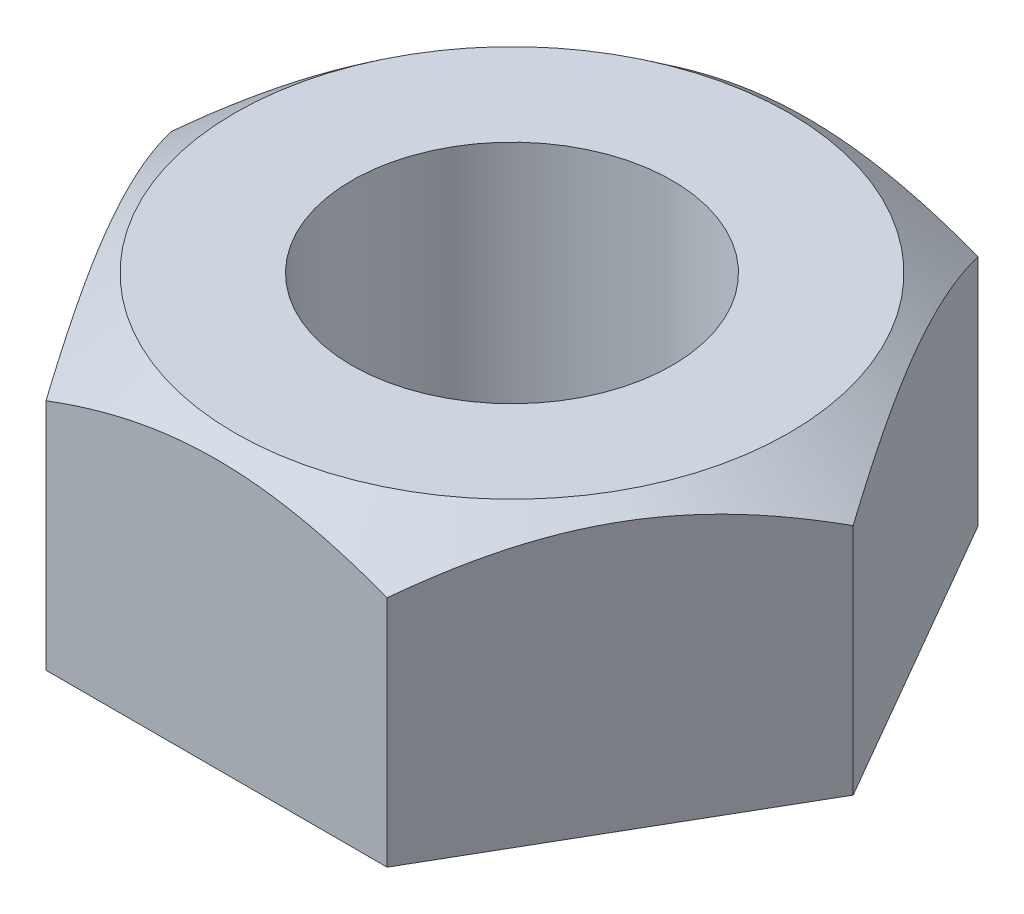
ISO-10303-21;
HEADER;
FILE_DESCRIPTION(('STEP AP214'),'2;1');
FILE_NAME('part.step','',(''),(''),'','','');
FILE_SCHEMA(('AUTOMOTIVE_DESIGN { 1 0 10303 214 1 1 1 1 }'));
ENDSEC;
DATA;
#1=APPLICATION_CONTEXT('core data for automotive mechanical design processes');
#2=APPLICATION_PROTOCOL_DEFINITION('international standard','automotive_design',2000,#1);
#3=PRODUCT_CONTEXT('',#1,'mechanical');
#4=PRODUCT('Part','Part','',(#3));
#5=PRODUCT_RELATED_PRODUCT_CATEGORY('part','',(#4));
#6=PRODUCT_DEFINITION_FORMATION('','',#4);
#7=PRODUCT_DEFINITION_CONTEXT('part definition',#1,'design');
#8=PRODUCT_DEFINITION('design','',#6,#7);
#9=PRODUCT_DEFINITION_SHAPE('','',#8);
#10=(LENGTH_UNIT() NAMED_UNIT(*) SI_UNIT(.MILLI.,.METRE.));
#11=(NAMED_UNIT(*) PLANE_ANGLE_UNIT() SI_UNIT($,.RADIAN.));
#12=(NAMED_UNIT(*) SI_UNIT($,.STERADIAN.) SOLID_ANGLE_UNIT());
#13=UNCERTAINTY_MEASURE_WITH_UNIT(LENGTH_MEASURE(1.E-05),#10,'distance_accuracy_value','');
#14=(GEOMETRIC_REPRESENTATION_CONTEXT(3) GLOBAL_UNCERTAINTY_ASSIGNED_CONTEXT((#13)) GLOBAL_UNIT_ASSIGNED_CONTEXT((#10,
#11,#12)) REPRESENTATION_CONTEXT('',''));
#15=CARTESIAN_POINT('',(0.,0.,0.));
#16=DIRECTION('',(0.,0.,1.));
#17=DIRECTION('',(1.,0.,0.));
#18=AXIS2_PLACEMENT_3D('',#15,#16,#17);
#19=CARTESIAN_POINT('',(4.57838763467376,3.78,0.));
#20=DIRECTION('',(0.,1.,0.));
#21=DIRECTION('',(0.,0.,1.));
#22=AXIS2_PLACEMENT_3D('',#19,#20,#21);
#23=PLANE('',#22);
#24=CARTESIAN_POINT('',(0.,3.78,0.));
#25=DIRECTION('',(0.,1.,0.));
#26=DIRECTION('',(0.,0.,1.));
#27=AXIS2_PLACEMENT_3D('',#24,#25,#26);
#28=CIRCLE('',#27,3.71985974759132);
#29=CARTESIAN_POINT('',(0.,3.78,3.71985974759133));
#30=VERTEX_POINT('',#29);
#31=EDGE_CURVE('E95',#30,#30,#28,.F.);
#32=ORIENTED_EDGE('',*,*,#31,.F.);
#33=EDGE_LOOP('',(#32));
#34=FACE_BOUND('',#33,.T.);
#35=CARTESIAN_POINT('',(0.,3.78,0.));
#36=DIRECTION('',(0.,1.,0.));
#37=DIRECTION('',(0.,0.,1.));
#38=AXIS2_PLACEMENT_3D('',#35,#36,#37);
#39=CIRCLE('',#38,2.15);
#40=CARTESIAN_POINT('',(0.,3.78,2.15));
#41=VERTEX_POINT('',#40);
#42=EDGE_CURVE('E129',#41,#41,#39,.T.);
#43=ORIENTED_EDGE('',*,*,#42,.F.);
#44=EDGE_LOOP('',(#43));
#45=FACE_BOUND('',#44,.T.);
#46=ADVANCED_FACE('F32',(#34,#45),#23,.T.);
#47=CARTESIAN_POINT('',(4.57838763467376,0.,0.));
#48=DIRECTION('',(0.,1.,0.));
#49=DIRECTION('',(0.,0.,1.));
#50=AXIS2_PLACEMENT_3D('',#47,#48,#49);
#51=PLANE('',#50);
#52=DIRECTION('',(0.5,0.,-0.866025403784439));
#53=VECTOR('',#52,1.);
#54=CARTESIAN_POINT('',(2.28919381733688,0.,3.965));
#55=LINE('',#54,#53);
#56=CARTESIAN_POINT('',(2.28919381733688,0.,3.965));
#57=VERTEX_POINT('',#56);
#58=CARTESIAN_POINT('',(4.57838763467376,0.,0.));
#59=VERTEX_POINT('',#58);
#60=EDGE_CURVE('E124',#57,#59,#55,.T.);
#61=ORIENTED_EDGE('',*,*,#60,.F.);
#62=DIRECTION('',(1.,0.,0.));
#63=VECTOR('',#62,1.);
#64=CARTESIAN_POINT('',(-2.28919381733685,0.,3.965));
#65=LINE('',#64,#63);
#66=CARTESIAN_POINT('',(-2.28919381733685,0.,3.965));
#67=VERTEX_POINT('',#66);
#68=EDGE_CURVE('E100',#67,#57,#65,.T.);
#69=ORIENTED_EDGE('',*,*,#68,.F.);
#70=DIRECTION('',(0.5,0.,0.866025403784438));
#71=VECTOR('',#70,1.);
#72=CARTESIAN_POINT('',(-4.57838763467372,0.,0.));
#73=LINE('',#72,#71);
#74=CARTESIAN_POINT('',(-4.57838763467372,0.,0.));
#75=VERTEX_POINT('',#74);
#76=EDGE_CURVE('E106',#75,#67,#73,.T.);
#77=ORIENTED_EDGE('',*,*,#76,.F.);
#78=DIRECTION('',(-0.499999999999999,0.,0.866025403784439));
#79=VECTOR('',#78,1.);
#80=CARTESIAN_POINT('',(-2.28919381733685,0.,-3.96500000000002));
#81=LINE('',#80,#79);
#82=CARTESIAN_POINT('',(-2.28919381733685,0.,-3.96500000000002));
#83=VERTEX_POINT('',#82);
#84=EDGE_CURVE('E137',#83,#75,#81,.T.);
#85=ORIENTED_EDGE('',*,*,#84,.F.);
#86=DIRECTION('',(-1.,0.,0.));
#87=VECTOR('',#86,1.);
#88=CARTESIAN_POINT('',(2.28919381733687,0.,-3.96500000000002));
#89=LINE('',#88,#87);
#90=CARTESIAN_POINT('',(2.28919381733687,0.,-3.96500000000002));
#91=VERTEX_POINT('',#90);
#92=EDGE_CURVE('E127',#91,#83,#89,.T.);
#93=ORIENTED_EDGE('',*,*,#92,.F.);
#94=DIRECTION('',(-0.500000000000005,0.,-0.866025403784436));
#95=VECTOR('',#94,1.);
#96=CARTESIAN_POINT('',(4.57838763467376,0.,0.));
#97=LINE('',#96,#95);
#98=EDGE_CURVE('E119',#59,#91,#97,.T.);
#99=ORIENTED_EDGE('',*,*,#98,.F.);
#100=EDGE_LOOP('',(#61,#69,#77,#85,#93,#99));
#101=FACE_BOUND('',#100,.T.);
#102=CARTESIAN_POINT('',(0.,0.,0.));
#103=DIRECTION('',(0.,1.,0.));
#104=DIRECTION('',(0.,0.,1.));
#105=AXIS2_PLACEMENT_3D('',#102,#103,#104);
#106=CIRCLE('',#105,2.15);
#107=CARTESIAN_POINT('',(0.,0.,2.15));
#108=VERTEX_POINT('',#107);
#109=EDGE_CURVE('E132',#108,#108,#106,.T.);
#110=ORIENTED_EDGE('',*,*,#109,.T.);
#111=EDGE_LOOP('',(#110));
#112=FACE_BOUND('',#111,.T.);
#113=ADVANCED_FACE('F122',(#101,#112),#51,.F.);
#114=CARTESIAN_POINT('',(2.28919381733688,3.78,3.965));
#115=DIRECTION('',(-0.866025403784439,0.,-0.5));
#116=DIRECTION('',(-0.5,0.,0.866025403784439));
#117=AXIS2_PLACEMENT_3D('',#114,#115,#116);
#118=PLANE('',#117);
#119=DIRECTION('',(0.,-1.,0.));
#120=VECTOR('',#119,1.);
#121=CARTESIAN_POINT('',(4.57838763467376,3.78,0.));
#122=LINE('',#121,#120);
#123=CARTESIAN_POINT('',(4.57838763467376,3.13206652974981,0.));
#124=VERTEX_POINT('',#123);
#125=EDGE_CURVE('E46',#124,#59,#122,.T.);
#126=ORIENTED_EDGE('',*,*,#125,.F.);
#127=CARTESIAN_POINT('',(4.5785031047276,3.13197938087073,-0.000200000000029202));
#128=CARTESIAN_POINT('',(4.49453094770417,3.1953356390344,0.1452440423857));
#129=CARTESIAN_POINT('',(4.40961618805642,3.25422296842079,0.2923207204081));
#130=CARTESIAN_POINT('',(4.23773273020105,3.36048959350545,0.590031602394233));
#131=CARTESIAN_POINT('',(4.15075850003086,3.40783279764712,0.740675387998189));
#132=CARTESIAN_POINT('',(3.97595280080165,3.48762975417761,1.04344774051578));
#133=CARTESIAN_POINT('',(3.88813765214138,3.52022249858707,1.19554803966958));
#134=CARTESIAN_POINT('',(3.71144342779108,3.56862663562246,1.50159141364828));
#135=CARTESIAN_POINT('',(3.62256581915185,3.58445895311229,1.65553194746665));
#136=CARTESIAN_POINT('',(3.44320363763633,3.59805354236678,1.96619635880792));
#137=CARTESIAN_POINT('',(3.35271402112904,3.59555902208431,2.12292897215596));
#138=CARTESIAN_POINT('',(3.17229909120901,3.57212927621106,2.43541679722144));
#139=CARTESIAN_POINT('',(3.08237413352028,3.55118341131496,2.5911713928068));
#140=CARTESIAN_POINT('',(2.90393499003854,3.49275564952198,2.90023705537624));
#141=CARTESIAN_POINT('',(2.81542050544767,3.45527730448355,3.05354863989341));
#142=CARTESIAN_POINT('',(2.64018656684796,3.36655221976539,3.35706272475852));
#143=CARTESIAN_POINT('',(2.55346666252809,3.31530898033654,3.50726600506804));
#144=CARTESIAN_POINT('',(2.43766148520866,3.23873484773292,3.70784645596482));
#145=CARTESIAN_POINT('',(2.40775554757692,3.21821318240896,3.75964505939098));
#146=CARTESIAN_POINT('',(2.34822460953224,3.17597432613281,3.86275566870659));
#147=CARTESIAN_POINT('',(2.31859915749062,3.15425968348198,3.91406845683987));
#148=CARTESIAN_POINT('',(2.28907834728304,3.13197938087076,3.9652));
#149=B_SPLINE_CURVE_WITH_KNOTS('',3,(#127,#128,#129,#130,#131,#132,#133,#134,#135,#136,#137,
#138,#139,#140,#141,#142,#143,#144,#145,#146,#147,#148),.UNSPECIFIED.,.F.,.F.,(4,2,2,2,2,2,2,2,
2,2,4),(0.,0.538710419493026,1.07908406883179,1.61425403349992,2.14875506454317,
2.69075955797448,3.23307678355528,3.77527755373571,4.31734057893856,4.50703621455635,
4.69634130940953),.UNSPECIFIED.);
#150=CARTESIAN_POINT('',(2.28919381733658,3.13206652975003,3.965));
#151=VERTEX_POINT('',#150);
#152=EDGE_CURVE('E90',#124,#151,#149,.T.);
#153=ORIENTED_EDGE('',*,*,#152,.T.);
#154=DIRECTION('',(0.,-1.,0.));
#155=VECTOR('',#154,1.);
#156=CARTESIAN_POINT('',(2.28919381733688,3.78,3.965));
#157=LINE('',#156,#155);
#158=EDGE_CURVE('E60',#151,#57,#157,.T.);
#159=ORIENTED_EDGE('',*,*,#158,.T.);
#160=ORIENTED_EDGE('',*,*,#60,.T.);
#161=EDGE_LOOP('',(#126,#153,#159,#160));
#162=FACE_BOUND('',#161,.T.);
#163=ADVANCED_FACE('F34',(#162),#118,.F.);
#164=CARTESIAN_POINT('',(4.57838763467376,3.78,0.));
#165=DIRECTION('',(-0.866025403784436,0.,0.500000000000005));
#166=DIRECTION('',(0.500000000000005,0.,0.866025403784436));
#167=AXIS2_PLACEMENT_3D('',#164,#165,#166);
#168=PLANE('',#167);
#169=DIRECTION('',(0.,-1.,0.));
#170=VECTOR('',#169,1.);
#171=CARTESIAN_POINT('',(2.28919381733687,3.78,-3.96500000000002));
#172=LINE('',#171,#170);
#173=CARTESIAN_POINT('',(2.28919381733657,3.13206652974998,-3.96500000000002));
#174=VERTEX_POINT('',#173);
#175=EDGE_CURVE('E113',#174,#91,#172,.T.);
#176=ORIENTED_EDGE('',*,*,#175,.F.);
#177=CARTESIAN_POINT('',(2.28907834728303,3.13197938087072,-3.96520000000002));
#178=CARTESIAN_POINT('',(2.37305050430646,3.19533563903439,-3.8197559576143));
#179=CARTESIAN_POINT('',(2.4579652639542,3.25422296842077,-3.6726792795919));
#180=CARTESIAN_POINT('',(2.62984872180958,3.36048959350543,-3.37496839760577));
#181=CARTESIAN_POINT('',(2.71682295197977,3.40783279764711,-3.22432461200182));
#182=CARTESIAN_POINT('',(2.89162865120898,3.48762975417759,-2.92155225948423));
#183=CARTESIAN_POINT('',(2.97944379986924,3.52022249858706,-2.76945196033043));
#184=CARTESIAN_POINT('',(3.15613802421955,3.56862663562244,-2.46340858635173));
#185=CARTESIAN_POINT('',(3.24501563285878,3.58445895311227,-2.30946805253337));
#186=CARTESIAN_POINT('',(3.4243778143743,3.59805354236676,-1.9988036411921));
#187=CARTESIAN_POINT('',(3.51486743088158,3.59555902208429,-1.84207102784406));
#188=CARTESIAN_POINT('',(3.69528236080162,3.57212927621104,-1.52958320277859));
#189=CARTESIAN_POINT('',(3.78520731849035,3.55118341131494,-1.37382860719323));
#190=CARTESIAN_POINT('',(3.96364646197208,3.49275564952196,-1.0647629446238));
#191=CARTESIAN_POINT('',(4.05216094656296,3.45527730448353,-0.911451360106631));
#192=CARTESIAN_POINT('',(4.22739488516267,3.36655221976537,-0.60793727524153));
#193=CARTESIAN_POINT('',(4.31411478948253,3.31530898033652,-0.457733994932012));
#194=CARTESIAN_POINT('',(4.42991996680197,3.2387348477329,-0.257153544035227));
#195=CARTESIAN_POINT('',(4.45982590443371,3.21821318240894,-0.205354940609062));
#196=CARTESIAN_POINT('',(4.51935684247839,3.17597432613278,-0.102244331293445));
#197=CARTESIAN_POINT('',(4.54898229452002,3.15425968348195,-0.0509315431601627));
#198=CARTESIAN_POINT('',(4.5785031047276,3.13197938087073,0.000199999999971293));
#199=B_SPLINE_CURVE_WITH_KNOTS('',3,(#177,#178,#179,#180,#181,#182,#183,#184,#185,#186,#187,
#188,#189,#190,#191,#192,#193,#194,#195,#196,#197,#198),.UNSPECIFIED.,.F.,.F.,(4,2,2,2,2,2,2,2,
2,2,4),(0.,0.538710419493019,1.07908406883177,1.6142540334999,2.14875506454314,2.69075955797445,
3.23307678355524,3.77527755373567,4.3173405789385,4.50703621455632,4.69634130940951),.UNSPECIFIED.);
#200=EDGE_CURVE('E96',#174,#124,#199,.T.);
#201=ORIENTED_EDGE('',*,*,#200,.T.);
#202=ORIENTED_EDGE('',*,*,#125,.T.);
#203=ORIENTED_EDGE('',*,*,#98,.T.);
#204=EDGE_LOOP('',(#176,#201,#202,#203));
#205=FACE_BOUND('',#204,.T.);
#206=ADVANCED_FACE('F118',(#205),#168,.F.);
#207=CARTESIAN_POINT('',(2.28919381733687,3.78,-3.96500000000002));
#208=DIRECTION('',(0.,0.,1.));
#209=DIRECTION('',(1.,0.,0.));
#210=AXIS2_PLACEMENT_3D('',#207,#208,#209);
#211=PLANE('',#210);
#212=DIRECTION('',(0.,-1.,0.));
#213=VECTOR('',#212,1.);
#214=CARTESIAN_POINT('',(-2.28919381733685,3.78,-3.96500000000002));
#215=LINE('',#214,#213);
#216=CARTESIAN_POINT('',(-2.28919381733685,3.13206652974981,-3.96500000000002));
#217=VERTEX_POINT('',#216);
#218=EDGE_CURVE('E111',#217,#83,#215,.T.);
#219=ORIENTED_EDGE('',*,*,#218,.F.);
#220=CARTESIAN_POINT('',(-5.62818673837586,1.39156175194742,-3.96500000000002));
#221=CARTESIAN_POINT('',(-5.48063697017761,1.48257352564659,-3.96500000000002));
#222=CARTESIAN_POINT('',(-5.33256992957874,1.5727601837387,-3.96500000000002));
#223=CARTESIAN_POINT('',(-5.03515504136378,1.75105973548884,-3.96500000000002));
#224=CARTESIAN_POINT('',(-4.88580695257722,1.83917222642963,-3.96500000000002));
#225=CARTESIAN_POINT('',(-4.58465365467147,2.01343548171486,-3.96500000000002));
#226=CARTESIAN_POINT('',(-4.43283874667018,2.09956954027497,-3.96500000000002));
#227=CARTESIAN_POINT('',(-4.12744960009063,2.26864897564406,-3.96500000000002));
#228=CARTESIAN_POINT('',(-3.97387546260006,2.35159453448735,-3.96500000000002));
#229=CARTESIAN_POINT('',(-3.65670525690032,2.51765729956301,-3.96500000000002));
#230=CARTESIAN_POINT('',(-3.49299905828949,2.60056526416287,-3.96500000000002));
#231=CARTESIAN_POINT('',(-3.16281577649889,2.7607676354133,-3.96500000000002));
#232=CARTESIAN_POINT('',(-2.99633830380707,2.83806124461718,-3.96500000000002));
#233=CARTESIAN_POINT('',(-2.66058698932342,2.98520908300999,-3.96500000000002));
#234=CARTESIAN_POINT('',(-2.49132104679178,3.05508117018784,-3.96500000000002));
#235=CARTESIAN_POINT('',(-2.14925356310845,3.18546642425514,-3.96500000000002));
#236=CARTESIAN_POINT('',(-1.9764534329443,3.24598324662594,-3.96500000000002));
#237=CARTESIAN_POINT('',(-1.62562005307041,3.35551730018334,-3.96500000000002));
#238=CARTESIAN_POINT('',(-1.44755545396735,3.40443586879636,-3.96500000000002));
#239=CARTESIAN_POINT('',(-1.08788697750087,3.48708940944778,-3.96500000000002));
#240=CARTESIAN_POINT('',(-0.906283722254579,3.52082702570591,-3.96500000000002));
#241=CARTESIAN_POINT('',(-0.543916884333584,3.5699046866607,-3.96500000000002));
#242=CARTESIAN_POINT('',(-0.363198339983936,3.58556888564505,-3.96500000000002));
#243=CARTESIAN_POINT('',(-0.00109624265457419,3.59810326191289,-3.96500000000002));
#244=CARTESIAN_POINT('',(0.180287269820742,3.59497456550305,-3.96500000000002));
#245=CARTESIAN_POINT('',(0.525225569926196,3.57138269247795,-3.96500000000002));
#246=CARTESIAN_POINT('',(0.688895393708764,3.5525291344796,-3.96500000000002));
#247=CARTESIAN_POINT('',(1.01401404856178,3.50101731912306,-3.96500000000002));
#248=CARTESIAN_POINT('',(1.17546272724059,3.46835811939588,-3.96500000000002));
#249=CARTESIAN_POINT('',(1.49874272783478,3.39048692783438,-3.96500000000002));
#250=CARTESIAN_POINT('',(1.66051491692415,3.34503290264568,-3.96500000000002));
#251=CARTESIAN_POINT('',(1.9007526210549,3.26937394287259,-3.96500000000002));
#252=CARTESIAN_POINT('',(1.98042764370389,3.24290827036426,-3.96500000000002));
#253=CARTESIAN_POINT('',(2.13899794809724,3.18774016725009,-3.96500000000002));
#254=CARTESIAN_POINT('',(2.21789325522165,3.15903780972122,-3.96500000000002));
#255=CARTESIAN_POINT('',(2.44754521182336,3.07217612628398,-3.96500000000002));
#256=CARTESIAN_POINT('',(2.59728468211934,3.01132249360124,-3.96500000000002));
#257=CARTESIAN_POINT('',(2.89424776006045,2.88372768171847,-3.96500000000002));
#258=CARTESIAN_POINT('',(3.04147075574475,2.81698509407919,-3.96500000000002));
#259=CARTESIAN_POINT('',(3.33381953982155,2.67874269801348,-3.96500000000002));
#260=CARTESIAN_POINT('',(3.47894329941233,2.6072386188675,-3.96500000000002));
#261=CARTESIAN_POINT('',(3.76724959777882,2.46046289430298,-3.96500000000002));
#262=CARTESIAN_POINT('',(3.91043228550867,2.38519154008165,-3.96500000000002));
#263=CARTESIAN_POINT('',(4.19579529351387,2.23124802568765,-3.96500000000002));
#264=CARTESIAN_POINT('',(4.33796807469374,2.15256193357032,-3.96500000000002));
#265=CARTESIAN_POINT('',(4.62089367234085,1.9926727336911,-3.96500000000002));
#266=CARTESIAN_POINT('',(4.76164643624346,1.91146953320347,-3.96500000000002));
#267=CARTESIAN_POINT('',(5.1819511088203,1.66486044364505,-3.96500000000002));
#268=CARTESIAN_POINT('',(5.45969561996314,1.49637494069424,-3.96500000000002));
#269=CARTESIAN_POINT('',(5.98335942734131,1.17126568193084,-3.96500000000002));
#270=CARTESIAN_POINT('',(6.2296246823551,1.0151945067171,-3.96500000000002));
#271=CARTESIAN_POINT('',(6.71997398719101,0.699599381129443,-3.96500000000002));
#272=CARTESIAN_POINT('',(6.96405775891958,0.540074999169752,-3.96500000000002));
#273=CARTESIAN_POINT('',(7.44811659219575,0.219997042909825,-3.96500000000002));
#274=CARTESIAN_POINT('',(7.6881084822573,0.05946884482282,-3.96500000000002));
#275=CARTESIAN_POINT('',(8.16667965637407,-0.263578952136957,-3.96500000000002));
#276=CARTESIAN_POINT('',(8.40525921239345,-0.426098147802891,-3.96500000000002));
#277=CARTESIAN_POINT('',(8.64332066672175,-0.589364012555049,-3.96500000000002));
#278=B_SPLINE_CURVE_WITH_KNOTS('',3,(#220,#221,#222,#223,#224,#225,#226,#227,#228,#229,#230,
#231,#232,#233,#234,#235,#236,#237,#238,#239,#240,#241,#242,#243,#244,#245,#246,#247,#248,#249,
#250,#251,#252,#253,#254,#255,#256,#257,#258,#259,#260,#261,#262,#263,#264,#265,#266,#267,#268,
#269,#270,#271,#272,#273,#274,#275,#276,#277),.UNSPECIFIED.,.F.,.F.,(4,2,2,2,2,2,2,2,2,2,2,2,2,
2,2,2,2,2,2,2,2,2,2,2,2,2,2,2,4),(0.,0.520091175377746,1.04028251162032,1.56389381814375,
2.0874751866955,2.63790121461837,3.1884052711898,3.73755314868012,4.28648590649304,
4.83993295244527,5.39328356158695,5.93654727638402,6.47977843231073,6.97338525728955,
7.46702578116521,7.97071668148794,8.22255711096291,8.47438931575358,8.959112337674,
9.44395160485641,9.92923175345543,10.4144744493504,10.9019279628877,11.3893994547245,
12.3638424534601,13.2384799024839,14.1132273031571,14.9794086205588,15.8454173314537),.UNSPECIFIED.);
#279=EDGE_CURVE('E152',#217,#174,#278,.T.);
#280=ORIENTED_EDGE('',*,*,#279,.T.);
#281=ORIENTED_EDGE('',*,*,#175,.T.);
#282=ORIENTED_EDGE('',*,*,#92,.T.);
#283=EDGE_LOOP('',(#219,#280,#281,#282));
#284=FACE_BOUND('',#283,.T.);
#285=ADVANCED_FACE('F151',(#284),#211,.F.);
#286=CARTESIAN_POINT('',(-2.28919381733685,3.78,-3.96500000000002));
#287=DIRECTION('',(0.866025403784439,0.,0.499999999999999));
#288=DIRECTION('',(0.499999999999999,0.,-0.866025403784439));
#289=AXIS2_PLACEMENT_3D('',#286,#287,#288);
#290=PLANE('',#289);
#291=DIRECTION('',(0.,-1.,0.));
#292=VECTOR('',#291,1.);
#293=CARTESIAN_POINT('',(-4.57838763467372,3.78,0.));
#294=LINE('',#293,#292);
#295=CARTESIAN_POINT('',(-4.57838763467372,3.13206652974984,0.));
#296=VERTEX_POINT('',#295);
#297=EDGE_CURVE('E104',#296,#75,#294,.T.);
#298=ORIENTED_EDGE('',*,*,#297,.F.);
#299=CARTESIAN_POINT('',(-4.57850310472756,3.13197938087076,0.000199999999985952));
#300=CARTESIAN_POINT('',(-4.49453094770413,3.19533563903443,-0.145244042385742));
#301=CARTESIAN_POINT('',(-4.40961618805638,3.25422296842081,-0.292320720408141));
#302=CARTESIAN_POINT('',(-4.23773273020101,3.36048959350547,-0.590031602394271));
#303=CARTESIAN_POINT('',(-4.15075850003082,3.40783279764714,-0.740675387998227));
#304=CARTESIAN_POINT('',(-3.97595280080162,3.48762975417762,-1.04344774051582));
#305=CARTESIAN_POINT('',(-3.88813765214135,3.52022249858708,-1.19554803966961));
#306=CARTESIAN_POINT('',(-3.71144342779104,3.56862663562247,-1.50159141364831));
#307=CARTESIAN_POINT('',(-3.62256581915182,3.58445895311229,-1.65553194746668));
#308=CARTESIAN_POINT('',(-3.4432036376363,3.59805354236678,-1.96619635880795));
#309=CARTESIAN_POINT('',(-3.35271402112902,3.59555902208431,-2.12292897215598));
#310=CARTESIAN_POINT('',(-3.17229909120899,3.57212927621105,-2.43541679722146));
#311=CARTESIAN_POINT('',(-3.08237413352026,3.55118341131496,-2.59117139280682));
#312=CARTESIAN_POINT('',(-2.90393499003852,3.49275564952197,-2.90023705537626));
#313=CARTESIAN_POINT('',(-2.81542050544765,3.45527730448354,-3.05354863989342));
#314=CARTESIAN_POINT('',(-2.64018656684794,3.36655221976538,-3.35706272475852));
#315=CARTESIAN_POINT('',(-2.55346666252808,3.31530898033652,-3.50726600506804));
#316=CARTESIAN_POINT('',(-2.43766148520864,3.2387348477329,-3.70784645596483));
#317=CARTESIAN_POINT('',(-2.4077555475769,3.21821318240893,-3.75964505939099));
#318=CARTESIAN_POINT('',(-2.34822460953222,3.17597432613277,-3.86275566870661));
#319=CARTESIAN_POINT('',(-2.3185991574906,3.15425968348195,-3.91406845683989));
#320=CARTESIAN_POINT('',(-2.28907834728301,3.13197938087072,-3.96520000000002));
#321=B_SPLINE_CURVE_WITH_KNOTS('',3,(#299,#300,#301,#302,#303,#304,#305,#306,#307,#308,#309,
#310,#311,#312,#313,#314,#315,#316,#317,#318,#319,#320),.UNSPECIFIED.,.F.,.F.,(4,2,2,2,2,2,2,2,
2,2,4),(0.,0.538710419493018,1.07908406883177,1.6142540334999,2.14875506454314,2.69075955797445,
3.23307678355524,3.77527755373566,4.3173405789385,4.50703621455632,4.69634130940951),.UNSPECIFIED.);
#322=EDGE_CURVE('E148',#296,#217,#321,.T.);
#323=ORIENTED_EDGE('',*,*,#322,.T.);
#324=ORIENTED_EDGE('',*,*,#218,.T.);
#325=ORIENTED_EDGE('',*,*,#84,.T.);
#326=EDGE_LOOP('',(#298,#323,#324,#325));
#327=FACE_BOUND('',#326,.T.);
#328=ADVANCED_FACE('F145',(#327),#290,.F.);
#329=CARTESIAN_POINT('',(-4.57838763467372,3.78,0.));
#330=DIRECTION('',(0.866025403784438,0.,-0.5));
#331=DIRECTION('',(-0.5,0.,-0.866025403784439));
#332=AXIS2_PLACEMENT_3D('',#329,#330,#331);
#333=PLANE('',#332);
#334=DIRECTION('',(0.,-1.,0.));
#335=VECTOR('',#334,1.);
#336=CARTESIAN_POINT('',(-2.28919381733685,3.78,3.965));
#337=LINE('',#336,#335);
#338=CARTESIAN_POINT('',(-2.28919381733685,3.13206652974986,3.965));
#339=VERTEX_POINT('',#338);
#340=EDGE_CURVE('E102',#339,#67,#337,.T.);
#341=ORIENTED_EDGE('',*,*,#340,.F.);
#342=CARTESIAN_POINT('',(-2.28907834728301,3.13197938087077,3.9652));
#343=CARTESIAN_POINT('',(-2.37305050430644,3.19533563903445,3.81975595761427));
#344=CARTESIAN_POINT('',(-2.45796526395418,3.25422296842083,3.67267927959187));
#345=CARTESIAN_POINT('',(-2.62984872180956,3.36048959350549,3.37496839760573));
#346=CARTESIAN_POINT('',(-2.71682295197975,3.40783279764716,3.22432461200178));
#347=CARTESIAN_POINT('',(-2.89162865120896,3.48762975417764,2.92155225948418));
#348=CARTESIAN_POINT('',(-2.97944379986922,3.5202224985871,2.76945196033039));
#349=CARTESIAN_POINT('',(-3.15613802421953,3.56862663562249,2.46340858635168));
#350=CARTESIAN_POINT('',(-3.24501563285876,3.58445895311231,2.30946805253332));
#351=CARTESIAN_POINT('',(-3.42437781437428,3.5980535423668,1.99880364119205));
#352=CARTESIAN_POINT('',(-3.51486743088156,3.59555902208433,1.84207102784401));
#353=CARTESIAN_POINT('',(-3.6952823608016,3.57212927621108,1.52958320277853));
#354=CARTESIAN_POINT('',(-3.78520731849033,3.55118341131498,1.37382860719317));
#355=CARTESIAN_POINT('',(-3.96364646197206,3.49275564952199,1.06476294462373));
#356=CARTESIAN_POINT('',(-4.05216094656294,3.45527730448356,0.911451360106562));
#357=CARTESIAN_POINT('',(-4.22739488516265,3.3665522197654,0.607937275241458));
#358=CARTESIAN_POINT('',(-4.31411478948251,3.31530898033654,0.457733994931939));
#359=CARTESIAN_POINT('',(-4.42991996680195,3.23873484773292,0.257153544035158));
#360=CARTESIAN_POINT('',(-4.45982590443369,3.21821318240896,0.205354940608999));
#361=CARTESIAN_POINT('',(-4.51935684247836,3.1759743261328,0.102244331293392));
#362=CARTESIAN_POINT('',(-4.54898229451998,3.15425968348198,0.0509315431601143));
#363=CARTESIAN_POINT('',(-4.57850310472756,3.13197938087076,-0.000200000000014679));
#364=B_SPLINE_CURVE_WITH_KNOTS('',3,(#342,#343,#344,#345,#346,#347,#348,#349,#350,#351,#352,
#353,#354,#355,#356,#357,#358,#359,#360,#361,#362,#363),.UNSPECIFIED.,.F.,.F.,(4,2,2,2,2,2,2,2,
2,2,4),(0.,0.538710419493024,1.07908406883178,1.61425403349991,2.14875506454316,
2.69075955797447,3.23307678355527,3.7752775537357,4.31734057893854,4.50703621455634,
4.69634130940951),.UNSPECIFIED.);
#365=EDGE_CURVE('E53',#339,#296,#364,.T.);
#366=ORIENTED_EDGE('',*,*,#365,.T.);
#367=ORIENTED_EDGE('',*,*,#297,.T.);
#368=ORIENTED_EDGE('',*,*,#76,.T.);
#369=EDGE_LOOP('',(#341,#366,#367,#368));
#370=FACE_BOUND('',#369,.T.);
#371=ADVANCED_FACE('F142',(#370),#333,.F.);
#372=CARTESIAN_POINT('',(-2.28919381733685,3.78,3.965));
#373=DIRECTION('',(0.,0.,-1.));
#374=DIRECTION('',(-1.,0.,0.));
#375=AXIS2_PLACEMENT_3D('',#372,#373,#374);
#376=PLANE('',#375);
#377=ORIENTED_EDGE('',*,*,#158,.F.);
#378=CARTESIAN_POINT('',(-5.62818673837587,1.39156175194748,3.965));
#379=CARTESIAN_POINT('',(-5.48063697017762,1.48257352564664,3.965));
#380=CARTESIAN_POINT('',(-5.33256992957875,1.57276018373876,3.965));
#381=CARTESIAN_POINT('',(-5.03515504136379,1.7510597354889,3.965));
#382=CARTESIAN_POINT('',(-4.88580695257723,1.83917222642969,3.965));
#383=CARTESIAN_POINT('',(-4.58465365467148,2.01343548171492,3.965));
#384=CARTESIAN_POINT('',(-4.43283874667019,2.09956954027502,3.965));
#385=CARTESIAN_POINT('',(-4.12744960009064,2.26864897564411,3.965));
#386=CARTESIAN_POINT('',(-3.97387546260007,2.35159453448741,3.965));
#387=CARTESIAN_POINT('',(-3.65670525690033,2.51765729956306,3.965));
#388=CARTESIAN_POINT('',(-3.4929990582895,2.60056526416292,3.965));
#389=CARTESIAN_POINT('',(-3.16281577649889,2.76076763541335,3.965));
#390=CARTESIAN_POINT('',(-2.99633830380708,2.83806124461723,3.965));
#391=CARTESIAN_POINT('',(-2.66058698932343,2.98520908301004,3.965));
#392=CARTESIAN_POINT('',(-2.49132104679178,3.05508117018789,3.965));
#393=CARTESIAN_POINT('',(-2.14925356310845,3.18546642425519,3.965));
#394=CARTESIAN_POINT('',(-1.9764534329443,3.24598324662599,3.965));
#395=CARTESIAN_POINT('',(-1.62562005307041,3.35551730018338,3.965));
#396=CARTESIAN_POINT('',(-1.44755545396735,3.40443586879641,3.965));
#397=CARTESIAN_POINT('',(-1.08788697750087,3.48708940944782,3.965));
#398=CARTESIAN_POINT('',(-0.906283722254573,3.52082702570595,3.965));
#399=CARTESIAN_POINT('',(-0.543916884333574,3.56990468666075,3.965));
#400=CARTESIAN_POINT('',(-0.363198339983922,3.58556888564509,3.965));
#401=CARTESIAN_POINT('',(-0.00109624265455624,3.59810326191293,3.965));
#402=CARTESIAN_POINT('',(0.180287269820762,3.59497456550309,3.965));
#403=CARTESIAN_POINT('',(0.525225569926221,3.57138269247799,3.965));
#404=CARTESIAN_POINT('',(0.688895393708791,3.55252913447964,3.965));
#405=CARTESIAN_POINT('',(1.01401404856181,3.50101731912309,3.965));
#406=CARTESIAN_POINT('',(1.17546272724063,3.46835811939591,3.965));
#407=CARTESIAN_POINT('',(1.49874272783482,3.39048692783442,3.965));
#408=CARTESIAN_POINT('',(1.66051491692419,3.34503290264571,3.965));
#409=CARTESIAN_POINT('',(1.90075262105495,3.26937394287263,3.965));
#410=CARTESIAN_POINT('',(1.98042764370393,3.24290827036429,3.965));
#411=CARTESIAN_POINT('',(2.13899794809729,3.18774016725012,3.965));
#412=CARTESIAN_POINT('',(2.2178932552217,3.15903780972125,3.965));
#413=CARTESIAN_POINT('',(2.44754521182341,3.07217612628401,3.965));
#414=CARTESIAN_POINT('',(2.5972846821194,3.01132249360127,3.965));
#415=CARTESIAN_POINT('',(2.89424776006051,2.88372768171849,3.965));
#416=CARTESIAN_POINT('',(3.04147075574481,2.81698509407922,3.965));
#417=CARTESIAN_POINT('',(3.33381953982162,2.67874269801351,3.965));
#418=CARTESIAN_POINT('',(3.4789432994124,2.60723861886752,3.965));
#419=CARTESIAN_POINT('',(3.7672495977789,2.46046289430299,3.965));
#420=CARTESIAN_POINT('',(3.91043228550875,2.38519154008166,3.965));
#421=CARTESIAN_POINT('',(4.19579529351396,2.23124802568766,3.965));
#422=CARTESIAN_POINT('',(4.33796807469382,2.15256193357033,3.965));
#423=CARTESIAN_POINT('',(4.62089367234095,1.99267273369111,3.965));
#424=CARTESIAN_POINT('',(4.76164643624355,1.91146953320348,3.965));
#425=CARTESIAN_POINT('',(5.1819511088204,1.66486044364505,3.965));
#426=CARTESIAN_POINT('',(5.45969561996325,1.49637494069423,3.965));
#427=CARTESIAN_POINT('',(5.98335942734143,1.17126568193083,3.965));
#428=CARTESIAN_POINT('',(6.22962468235523,1.01519450671708,3.965));
#429=CARTESIAN_POINT('',(6.71997398719115,0.699599381129418,3.965));
#430=CARTESIAN_POINT('',(6.96405775891973,0.540074999169723,3.965));
#431=CARTESIAN_POINT('',(7.44811659219591,0.219997042909787,3.965));
#432=CARTESIAN_POINT('',(7.68810848225746,0.059468844822777,3.965));
#433=CARTESIAN_POINT('',(8.16667965637424,-0.26357895213701,3.965));
#434=CARTESIAN_POINT('',(8.40525921239364,-0.426098147802949,3.965));
#435=CARTESIAN_POINT('',(8.64332066672194,-0.58936401255511,3.965));
#436=B_SPLINE_CURVE_WITH_KNOTS('',3,(#378,#379,#380,#381,#382,#383,#384,#385,#386,#387,#388,
#389,#390,#391,#392,#393,#394,#395,#396,#397,#398,#399,#400,#401,#402,#403,#404,#405,#406,#407,
#408,#409,#410,#411,#412,#413,#414,#415,#416,#417,#418,#419,#420,#421,#422,#423,#424,#425,#426,
#427,#428,#429,#430,#431,#432,#433,#434,#435),.UNSPECIFIED.,.F.,.F.,(4,2,2,2,2,2,2,2,2,2,2,2,2,
2,2,2,2,2,2,2,2,2,2,2,2,2,2,2,4),(0.,0.520091175377747,1.04028251162032,1.56389381814376,
2.08747518669551,2.63790121461837,3.18840527118981,3.73755314868012,4.28648590649304,
4.83993295244528,5.39328356158696,5.93654727638404,6.47977843231075,6.97338525728959,
7.46702578116525,7.97071668148798,8.22255711096296,8.47438931575364,8.95911233767406,
9.44395160485648,9.92923175345551,10.4144744493505,10.9019279628878,11.3893994547246,
12.3638424534603,13.2384799024841,14.1132273031573,14.979408620559,15.845417331454),.UNSPECIFIED.);
#437=EDGE_CURVE('E11',#151,#339,#436,.F.);
#438=ORIENTED_EDGE('',*,*,#437,.T.);
#439=ORIENTED_EDGE('',*,*,#340,.T.);
#440=ORIENTED_EDGE('',*,*,#68,.T.);
#441=EDGE_LOOP('',(#377,#438,#439,#440));
#442=FACE_BOUND('',#441,.T.);
#443=ADVANCED_FACE('F98',(#442),#376,.F.);
#444=CARTESIAN_POINT('',(0.,3.78,0.));
#445=DIRECTION('',(0.,-1.,0.));
#446=DIRECTION('',(0.,0.,-1.));
#447=AXIS2_PLACEMENT_3D('',#444,#445,#446);
#448=CYLINDRICAL_SURFACE('',#447,2.15);
#449=ORIENTED_EDGE('',*,*,#42,.T.);
#450=EDGE_LOOP('',(#449));
#451=FACE_BOUND('',#450,.T.);
#452=ORIENTED_EDGE('',*,*,#109,.F.);
#453=EDGE_LOOP('',(#452));
#454=FACE_BOUND('',#453,.T.);
#455=ADVANCED_FACE('F172',(#451,#454),#448,.F.);
#456=CARTESIAN_POINT('',(0.,4.31695625743177,0.));
#457=DIRECTION('',(0.,-1.,0.));
#458=DIRECTION('',(0.,0.,-1.));
#459=AXIS2_PLACEMENT_3D('',#456,#457,#458);
#460=CONICAL_SURFACE('',#459,3.00837941463278,0.924292161922063);
#461=ORIENTED_EDGE('',*,*,#31,.T.);
#462=EDGE_LOOP('',(#461));
#463=FACE_BOUND('',#462,.T.);
#464=ORIENTED_EDGE('',*,*,#200,.F.);
#465=ORIENTED_EDGE('',*,*,#279,.F.);
#466=ORIENTED_EDGE('',*,*,#322,.F.);
#467=ORIENTED_EDGE('',*,*,#365,.F.);
#468=ORIENTED_EDGE('',*,*,#437,.F.);
#469=ORIENTED_EDGE('',*,*,#152,.F.);
#470=EDGE_LOOP('',(#464,#465,#466,#467,#468,#469));
#471=FACE_BOUND('',#470,.T.);
#472=ADVANCED_FACE('F89',(#463,#471),#460,.T.);
#473=CLOSED_SHELL('',(#46,#113,#163,#206,#285,#328,#371,#443,#455,#472));
#474=MANIFOLD_SOLID_BREP('B2',#473);
#475=ADVANCED_BREP_SHAPE_REPRESENTATION('',(#18,#474),#14);
#476=SHAPE_DEFINITION_REPRESENTATION(#9,#475);
ENDSEC;
END-ISO-10303-21;
